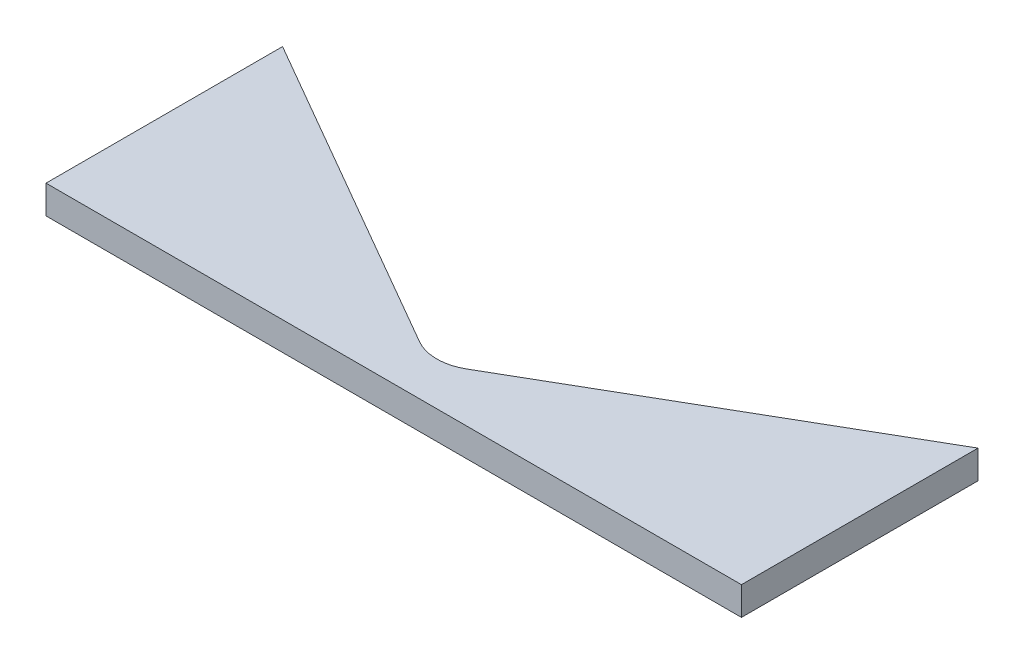
ISO-10303-21;
HEADER;
FILE_DESCRIPTION(('STEP AP214'),'2;1');
FILE_NAME('part.step','',(''),(''),'','','');
FILE_SCHEMA(('AUTOMOTIVE_DESIGN { 1 0 10303 214 1 1 1 1 }'));
ENDSEC;
DATA;
#1=APPLICATION_CONTEXT('core data for automotive mechanical design processes');
#2=APPLICATION_PROTOCOL_DEFINITION('international standard','automotive_design',2000,#1);
#3=PRODUCT_CONTEXT('',#1,'mechanical');
#4=PRODUCT('Part','Part','',(#3));
#5=PRODUCT_RELATED_PRODUCT_CATEGORY('part','',(#4));
#6=PRODUCT_DEFINITION_FORMATION('','',#4);
#7=PRODUCT_DEFINITION_CONTEXT('part definition',#1,'design');
#8=PRODUCT_DEFINITION('design','',#6,#7);
#9=PRODUCT_DEFINITION_SHAPE('','',#8);
#10=(LENGTH_UNIT() NAMED_UNIT(*) SI_UNIT(.MILLI.,.METRE.));
#11=(NAMED_UNIT(*) PLANE_ANGLE_UNIT() SI_UNIT($,.RADIAN.));
#12=(NAMED_UNIT(*) SI_UNIT($,.STERADIAN.) SOLID_ANGLE_UNIT());
#13=UNCERTAINTY_MEASURE_WITH_UNIT(LENGTH_MEASURE(1.E-05),#10,'distance_accuracy_value','');
#14=(GEOMETRIC_REPRESENTATION_CONTEXT(3) GLOBAL_UNCERTAINTY_ASSIGNED_CONTEXT((#13)) GLOBAL_UNIT_ASSIGNED_CONTEXT((#10,
#11,#12)) REPRESENTATION_CONTEXT('',''));
#15=CARTESIAN_POINT('',(0.,0.,0.));
#16=DIRECTION('',(0.,0.,1.));
#17=DIRECTION('',(1.,0.,0.));
#18=AXIS2_PLACEMENT_3D('',#15,#16,#17);
#19=CARTESIAN_POINT('',(-233.3625,19.05,0.));
#20=DIRECTION('',(1.,0.,0.));
#21=DIRECTION('',(0.,0.,-1.));
#22=AXIS2_PLACEMENT_3D('',#19,#20,#21);
#23=PLANE('',#22);
#24=DIRECTION('',(0.,0.,1.));
#25=VECTOR('',#24,1.);
#26=CARTESIAN_POINT('',(-233.3625,0.,0.));
#27=LINE('',#26,#25);
#28=CARTESIAN_POINT('',(-233.3625,0.,-158.75));
#29=VERTEX_POINT('',#28);
#30=CARTESIAN_POINT('',(-233.3625,0.,0.));
#31=VERTEX_POINT('',#30);
#32=EDGE_CURVE('E120',#29,#31,#27,.T.);
#33=ORIENTED_EDGE('',*,*,#32,.T.);
#34=DIRECTION('',(0.,-1.,0.));
#35=VECTOR('',#34,1.);
#36=CARTESIAN_POINT('',(-233.3625,19.05,0.));
#37=LINE('',#36,#35);
#38=CARTESIAN_POINT('',(-233.3625,19.05,0.));
#39=VERTEX_POINT('',#38);
#40=EDGE_CURVE('E11',#39,#31,#37,.T.);
#41=ORIENTED_EDGE('',*,*,#40,.F.);
#42=DIRECTION('',(0.,0.,1.));
#43=VECTOR('',#42,1.);
#44=CARTESIAN_POINT('',(-233.3625,19.05,0.));
#45=LINE('',#44,#43);
#46=CARTESIAN_POINT('',(-233.3625,19.05,-158.75));
#47=VERTEX_POINT('',#46);
#48=EDGE_CURVE('E130',#47,#39,#45,.T.);
#49=ORIENTED_EDGE('',*,*,#48,.F.);
#50=DIRECTION('',(0.,-1.,0.));
#51=VECTOR('',#50,1.);
#52=CARTESIAN_POINT('',(-233.3625,19.05,-158.75));
#53=LINE('',#52,#51);
#54=EDGE_CURVE('E116',#47,#29,#53,.T.);
#55=ORIENTED_EDGE('',*,*,#54,.T.);
#56=EDGE_LOOP('',(#33,#41,#49,#55));
#57=FACE_BOUND('',#56,.T.);
#58=ADVANCED_FACE('F36',(#57),#23,.F.);
#59=CARTESIAN_POINT('',(-233.3625,19.05,0.));
#60=DIRECTION('',(0.,0.,-1.));
#61=DIRECTION('',(-1.,0.,0.));
#62=AXIS2_PLACEMENT_3D('',#59,#60,#61);
#63=PLANE('',#62);
#64=DIRECTION('',(1.,0.,0.));
#65=VECTOR('',#64,1.);
#66=CARTESIAN_POINT('',(-233.3625,0.,0.));
#67=LINE('',#66,#65);
#68=CARTESIAN_POINT('',(233.3625,0.,0.));
#69=VERTEX_POINT('',#68);
#70=EDGE_CURVE('E123',#31,#69,#67,.T.);
#71=ORIENTED_EDGE('',*,*,#70,.T.);
#72=DIRECTION('',(0.,-1.,0.));
#73=VECTOR('',#72,1.);
#74=CARTESIAN_POINT('',(233.3625,19.05,0.));
#75=LINE('',#74,#73);
#76=CARTESIAN_POINT('',(233.3625,19.05,0.));
#77=VERTEX_POINT('',#76);
#78=EDGE_CURVE('E44',#77,#69,#75,.T.);
#79=ORIENTED_EDGE('',*,*,#78,.F.);
#80=DIRECTION('',(1.,0.,0.));
#81=VECTOR('',#80,1.);
#82=CARTESIAN_POINT('',(-233.3625,19.05,0.));
#83=LINE('',#82,#81);
#84=EDGE_CURVE('E89',#39,#77,#83,.T.);
#85=ORIENTED_EDGE('',*,*,#84,.F.);
#86=ORIENTED_EDGE('',*,*,#40,.T.);
#87=EDGE_LOOP('',(#71,#79,#85,#86));
#88=FACE_BOUND('',#87,.T.);
#89=ADVANCED_FACE('F154',(#88),#63,.F.);
#90=CARTESIAN_POINT('',(233.3625,19.05,0.));
#91=DIRECTION('',(-1.,0.,0.));
#92=DIRECTION('',(0.,0.,1.));
#93=AXIS2_PLACEMENT_3D('',#90,#91,#92);
#94=PLANE('',#93);
#95=DIRECTION('',(0.,0.,-1.));
#96=VECTOR('',#95,1.);
#97=CARTESIAN_POINT('',(233.3625,0.,0.));
#98=LINE('',#97,#96);
#99=CARTESIAN_POINT('',(233.3625,0.,-158.75));
#100=VERTEX_POINT('',#99);
#101=EDGE_CURVE('E125',#69,#100,#98,.T.);
#102=ORIENTED_EDGE('',*,*,#101,.T.);
#103=DIRECTION('',(0.,-1.,0.));
#104=VECTOR('',#103,1.);
#105=CARTESIAN_POINT('',(233.3625,19.05,-158.75));
#106=LINE('',#105,#104);
#107=CARTESIAN_POINT('',(233.3625,19.05,-158.75));
#108=VERTEX_POINT('',#107);
#109=EDGE_CURVE('E111',#108,#100,#106,.T.);
#110=ORIENTED_EDGE('',*,*,#109,.F.);
#111=DIRECTION('',(0.,0.,-1.));
#112=VECTOR('',#111,1.);
#113=CARTESIAN_POINT('',(233.3625,19.05,0.));
#114=LINE('',#113,#112);
#115=EDGE_CURVE('E102',#77,#108,#114,.T.);
#116=ORIENTED_EDGE('',*,*,#115,.F.);
#117=ORIENTED_EDGE('',*,*,#78,.T.);
#118=EDGE_LOOP('',(#102,#110,#116,#117));
#119=FACE_BOUND('',#118,.T.);
#120=ADVANCED_FACE('F136',(#119),#94,.F.);
#121=CARTESIAN_POINT('',(233.3625,19.05,-158.75));
#122=DIRECTION('',(0.500000000000004,0.,0.866025403784436));
#123=DIRECTION('',(0.866025403784436,0.,-0.500000000000004));
#124=AXIS2_PLACEMENT_3D('',#121,#122,#123);
#125=PLANE('',#124);
#126=DIRECTION('',(-0.866025403784436,0.,0.500000000000004));
#127=VECTOR('',#126,1.);
#128=CARTESIAN_POINT('',(233.3625,0.,-158.75));
#129=LINE('',#128,#127);
#130=CARTESIAN_POINT('',(15.8750000000001,0.,-33.1835333296199));
#131=VERTEX_POINT('',#130);
#132=EDGE_CURVE('E110',#100,#131,#129,.T.);
#133=ORIENTED_EDGE('',*,*,#132,.T.);
#134=DIRECTION('',(0.,-1.,0.));
#135=VECTOR('',#134,1.);
#136=CARTESIAN_POINT('',(15.8750000000001,19.05,-33.1835333296199));
#137=LINE('',#136,#135);
#138=CARTESIAN_POINT('',(15.8750000000001,19.05,-33.1835333296199));
#139=VERTEX_POINT('',#138);
#140=EDGE_CURVE('E107',#139,#131,#137,.T.);
#141=ORIENTED_EDGE('',*,*,#140,.F.);
#142=DIRECTION('',(-0.866025403784436,0.,0.500000000000004));
#143=VECTOR('',#142,1.);
#144=CARTESIAN_POINT('',(233.3625,19.05,-158.75));
#145=LINE('',#144,#143);
#146=EDGE_CURVE('E96',#108,#139,#145,.T.);
#147=ORIENTED_EDGE('',*,*,#146,.F.);
#148=ORIENTED_EDGE('',*,*,#109,.T.);
#149=EDGE_LOOP('',(#133,#141,#147,#148));
#150=FACE_BOUND('',#149,.T.);
#151=ADVANCED_FACE('F108',(#150),#125,.F.);
#152=CARTESIAN_POINT('',(0.,19.05,-60.6798398997758));
#153=DIRECTION('',(0.,-1.,0.));
#154=DIRECTION('',(0.,0.,-1.));
#155=AXIS2_PLACEMENT_3D('',#152,#153,#154);
#156=CYLINDRICAL_SURFACE('',#155,31.75);
#157=CARTESIAN_POINT('',(0.,0.,-60.6798398997758));
#158=DIRECTION('',(0.,-1.,0.));
#159=DIRECTION('',(0.,0.,1.));
#160=AXIS2_PLACEMENT_3D('',#157,#158,#159);
#161=CIRCLE('',#160,31.75);
#162=CARTESIAN_POINT('',(-15.8750000000001,0.,-33.1835333296199));
#163=VERTEX_POINT('',#162);
#164=EDGE_CURVE('E75',#131,#163,#161,.T.);
#165=ORIENTED_EDGE('',*,*,#164,.T.);
#166=DIRECTION('',(0.,-1.,0.));
#167=VECTOR('',#166,1.);
#168=CARTESIAN_POINT('',(-15.8750000000001,19.05,-33.1835333296199));
#169=LINE('',#168,#167);
#170=CARTESIAN_POINT('',(-15.8750000000001,19.05,-33.1835333296199));
#171=VERTEX_POINT('',#170);
#172=EDGE_CURVE('E112',#171,#163,#169,.T.);
#173=ORIENTED_EDGE('',*,*,#172,.F.);
#174=CARTESIAN_POINT('',(0.,19.05,-60.6798398997758));
#175=DIRECTION('',(0.,-1.,0.));
#176=DIRECTION('',(0.,0.,1.));
#177=AXIS2_PLACEMENT_3D('',#174,#175,#176);
#178=CIRCLE('',#177,31.75);
#179=EDGE_CURVE('E100',#139,#171,#178,.T.);
#180=ORIENTED_EDGE('',*,*,#179,.F.);
#181=ORIENTED_EDGE('',*,*,#140,.T.);
#182=EDGE_LOOP('',(#165,#173,#180,#181));
#183=FACE_BOUND('',#182,.T.);
#184=ADVANCED_FACE('F114',(#183),#156,.F.);
#185=CARTESIAN_POINT('',(-15.8750000000001,19.05,-33.1835333296199));
#186=DIRECTION('',(-0.500000000000004,0.,0.866025403784436));
#187=DIRECTION('',(0.866025403784436,0.,0.500000000000004));
#188=AXIS2_PLACEMENT_3D('',#185,#186,#187);
#189=PLANE('',#188);
#190=DIRECTION('',(-0.866025403784436,0.,-0.500000000000004));
#191=VECTOR('',#190,1.);
#192=CARTESIAN_POINT('',(-15.8750000000001,0.,-33.1835333296199));
#193=LINE('',#192,#191);
#194=EDGE_CURVE('E81',#163,#29,#193,.T.);
#195=ORIENTED_EDGE('',*,*,#194,.T.);
#196=ORIENTED_EDGE('',*,*,#54,.F.);
#197=DIRECTION('',(-0.866025403784436,0.,-0.500000000000004));
#198=VECTOR('',#197,1.);
#199=CARTESIAN_POINT('',(-15.8750000000001,19.05,-33.1835333296199));
#200=LINE('',#199,#198);
#201=EDGE_CURVE('E52',#171,#47,#200,.T.);
#202=ORIENTED_EDGE('',*,*,#201,.F.);
#203=ORIENTED_EDGE('',*,*,#172,.T.);
#204=EDGE_LOOP('',(#195,#196,#202,#203));
#205=FACE_BOUND('',#204,.T.);
#206=ADVANCED_FACE('F143',(#205),#189,.F.);
#207=CARTESIAN_POINT('',(0.,19.05,-60.6798398997758));
#208=DIRECTION('',(0.,1.,0.));
#209=DIRECTION('',(0.,0.,1.));
#210=AXIS2_PLACEMENT_3D('',#207,#208,#209);
#211=PLANE('',#210);
#212=ORIENTED_EDGE('',*,*,#48,.T.);
#213=ORIENTED_EDGE('',*,*,#84,.T.);
#214=ORIENTED_EDGE('',*,*,#115,.T.);
#215=ORIENTED_EDGE('',*,*,#146,.T.);
#216=ORIENTED_EDGE('',*,*,#179,.T.);
#217=ORIENTED_EDGE('',*,*,#201,.T.);
#218=EDGE_LOOP('',(#212,#213,#214,#215,#216,#217));
#219=FACE_BOUND('',#218,.T.);
#220=ADVANCED_FACE('F98',(#219),#211,.T.);
#221=CARTESIAN_POINT('',(0.,0.,-60.6798398997758));
#222=DIRECTION('',(0.,1.,0.));
#223=DIRECTION('',(0.,0.,1.));
#224=AXIS2_PLACEMENT_3D('',#221,#222,#223);
#225=PLANE('',#224);
#226=ORIENTED_EDGE('',*,*,#32,.F.);
#227=ORIENTED_EDGE('',*,*,#194,.F.);
#228=ORIENTED_EDGE('',*,*,#164,.F.);
#229=ORIENTED_EDGE('',*,*,#132,.F.);
#230=ORIENTED_EDGE('',*,*,#101,.F.);
#231=ORIENTED_EDGE('',*,*,#70,.F.);
#232=EDGE_LOOP('',(#226,#227,#228,#229,#230,#231));
#233=FACE_BOUND('',#232,.T.);
#234=ADVANCED_FACE('F139',(#233),#225,.F.);
#235=CLOSED_SHELL('',(#58,#89,#120,#151,#184,#206,#220,#234));
#236=MANIFOLD_SOLID_BREP('B2',#235);
#237=ADVANCED_BREP_SHAPE_REPRESENTATION('',(#18,#236),#14);
#238=SHAPE_DEFINITION_REPRESENTATION(#9,#237);
ENDSEC;
END-ISO-10303-21;
